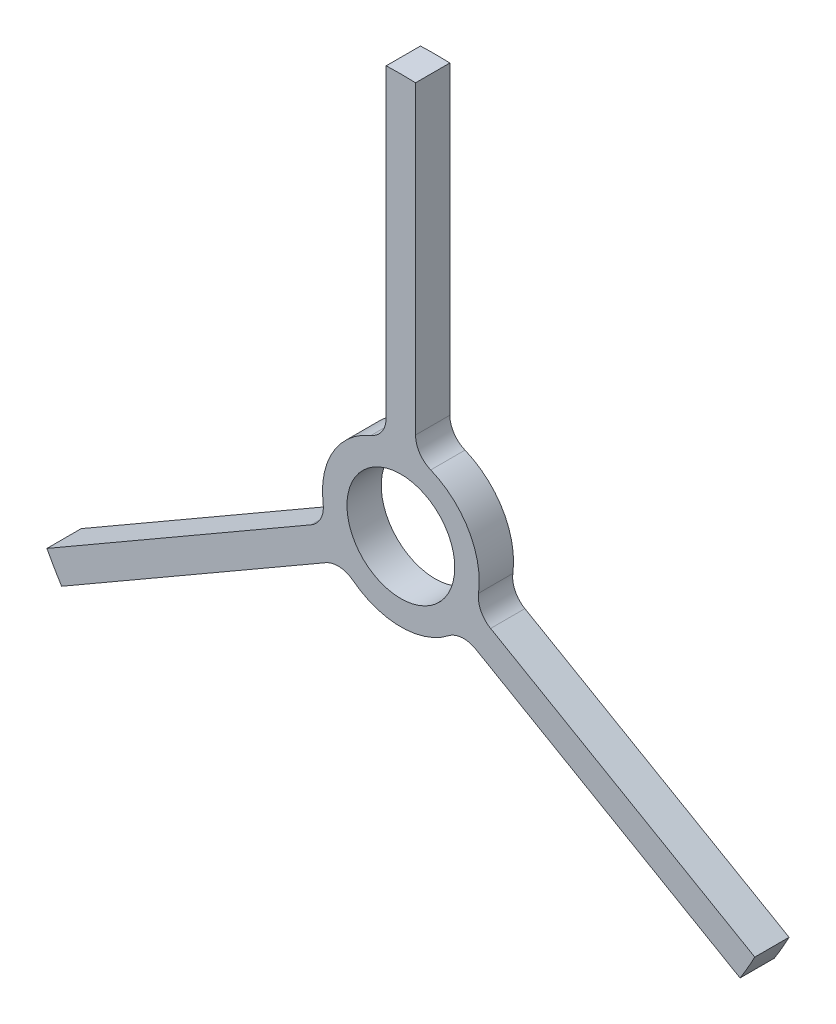
ISO-10303-21;
HEADER;
FILE_DESCRIPTION(('STEP AP214'),'2;1');
FILE_NAME('part.step','',(''),(''),'','','');
FILE_SCHEMA(('AUTOMOTIVE_DESIGN { 1 0 10303 214 1 1 1 1 }'));
ENDSEC;
DATA;
#1=APPLICATION_CONTEXT('core data for automotive mechanical design processes');
#2=APPLICATION_PROTOCOL_DEFINITION('international standard','automotive_design',2000,#1);
#3=PRODUCT_CONTEXT('',#1,'mechanical');
#4=PRODUCT('Part','Part','',(#3));
#5=PRODUCT_RELATED_PRODUCT_CATEGORY('part','',(#4));
#6=PRODUCT_DEFINITION_FORMATION('','',#4);
#7=PRODUCT_DEFINITION_CONTEXT('part definition',#1,'design');
#8=PRODUCT_DEFINITION('design','',#6,#7);
#9=PRODUCT_DEFINITION_SHAPE('','',#8);
#10=(LENGTH_UNIT() NAMED_UNIT(*) SI_UNIT(.MILLI.,.METRE.));
#11=(NAMED_UNIT(*) PLANE_ANGLE_UNIT() SI_UNIT($,.RADIAN.));
#12=(NAMED_UNIT(*) SI_UNIT($,.STERADIAN.) SOLID_ANGLE_UNIT());
#13=UNCERTAINTY_MEASURE_WITH_UNIT(LENGTH_MEASURE(1.E-05),#10,'distance_accuracy_value','');
#14=(GEOMETRIC_REPRESENTATION_CONTEXT(3) GLOBAL_UNCERTAINTY_ASSIGNED_CONTEXT((#13)) GLOBAL_UNIT_ASSIGNED_CONTEXT((#10,
#11,#12)) REPRESENTATION_CONTEXT('',''));
#15=CARTESIAN_POINT('',(0.,0.,0.));
#16=DIRECTION('',(0.,0.,1.));
#17=DIRECTION('',(1.,0.,0.));
#18=AXIS2_PLACEMENT_3D('',#15,#16,#17);
#19=CARTESIAN_POINT('',(0.,0.,7.));
#20=DIRECTION('',(0.,0.,1.));
#21=DIRECTION('',(1.,0.,0.));
#22=AXIS2_PLACEMENT_3D('',#19,#20,#21);
#23=PLANE('',#22);
#24=DIRECTION('',(0.,-1.,0.));
#25=VECTOR('',#24,1.);
#26=CARTESIAN_POINT('',(-3.,15.7162336455017,7.));
#27=LINE('',#26,#25);
#28=CARTESIAN_POINT('',(-3.,81.6690560773831,7.));
#29=VERTEX_POINT('',#28);
#30=CARTESIAN_POINT('',(-3.,19.4164878389476,7.));
#31=VERTEX_POINT('',#30);
#32=EDGE_CURVE('E228',#29,#31,#27,.T.);
#33=ORIENTED_EDGE('',*,*,#32,.T.);
#34=CARTESIAN_POINT('',(-8.,19.4164878389476,7.));
#35=DIRECTION('',(0.,0.,1.));
#36=DIRECTION('',(1.,0.,0.));
#37=AXIS2_PLACEMENT_3D('',#34,#35,#36);
#38=CIRCLE('',#37,5.);
#39=CARTESIAN_POINT('',(-6.0952380952381,14.7935145439601,7.));
#40=VERTEX_POINT('',#39);
#41=EDGE_CURVE('E333',#31,#40,#38,.F.);
#42=ORIENTED_EDGE('',*,*,#41,.T.);
#43=CARTESIAN_POINT('',(0.,0.,7.));
#44=DIRECTION('',(0.,0.,1.));
#45=DIRECTION('',(1.,0.,0.));
#46=AXIS2_PLACEMENT_3D('',#43,#44,#45);
#47=CIRCLE('',#46,16.);
#48=CARTESIAN_POINT('',(-15.8591784539431,-2.11812623938903,7.));
#49=VERTEX_POINT('',#48);
#50=EDGE_CURVE('E182',#40,#49,#47,.T.);
#51=ORIENTED_EDGE('',*,*,#50,.T.);
#52=CARTESIAN_POINT('',(-20.8151717208003,-2.7800406891981,7.));
#53=DIRECTION('',(0.,0.,1.));
#54=DIRECTION('',(1.,0.,0.));
#55=AXIS2_PLACEMENT_3D('',#52,#53,#54);
#56=CIRCLE('',#55,5.);
#57=CARTESIAN_POINT('',(-18.3151717208003,-7.11016770812032,7.));
#58=VERTEX_POINT('',#57);
#59=EDGE_CURVE('E177',#49,#58,#56,.F.);
#60=ORIENTED_EDGE('',*,*,#59,.T.);
#61=DIRECTION('',(-0.866025403784443,-0.499999999999992,0.));
#62=VECTOR('',#61,1.);
#63=CARTESIAN_POINT('',(-15.1106575888162,-5.2600406113974,7.));
#64=LINE('',#63,#62);
#65=CARTESIAN_POINT('',(-72.22747726611,-38.2364518273376,7.));
#66=VERTEX_POINT('',#65);
#67=EDGE_CURVE('E167',#58,#66,#64,.T.);
#68=ORIENTED_EDGE('',*,*,#67,.T.);
#69=CARTESIAN_POINT('',(0.,0.,7.));
#70=DIRECTION('',(0.,0.,1.));
#71=DIRECTION('',(1.,0.,0.));
#72=AXIS2_PLACEMENT_3D('',#69,#70,#71);
#73=CIRCLE('',#72,81.7241379310345);
#74=CARTESIAN_POINT('',(-69.2274772661101,-43.4326042500442,7.));
#75=VERTEX_POINT('',#74);
#76=EDGE_CURVE('E173',#66,#75,#73,.T.);
#77=ORIENTED_EDGE('',*,*,#76,.T.);
#78=DIRECTION('',(0.866025403784443,0.499999999999992,0.));
#79=VECTOR('',#78,1.);
#80=CARTESIAN_POINT('',(-12.1106575888163,-10.4561930341041,7.));
#81=LINE('',#80,#79);
#82=CARTESIAN_POINT('',(-15.3151717208004,-12.306320130827,7.));
#83=VERTEX_POINT('',#82);
#84=EDGE_CURVE('E199',#75,#83,#81,.T.);
#85=ORIENTED_EDGE('',*,*,#84,.T.);
#86=CARTESIAN_POINT('',(-12.8151717208004,-16.6364471497492,7.));
#87=DIRECTION('',(0.,0.,1.));
#88=DIRECTION('',(1.,0.,0.));
#89=AXIS2_PLACEMENT_3D('',#86,#87,#88);
#90=CIRCLE('',#89,5.);
#91=CARTESIAN_POINT('',(-9.76394035870506,-12.6753883045708,7.));
#92=VERTEX_POINT('',#91);
#93=EDGE_CURVE('E344',#83,#92,#90,.F.);
#94=ORIENTED_EDGE('',*,*,#93,.T.);
#95=CARTESIAN_POINT('',(0.,0.,7.));
#96=DIRECTION('',(0.,0.,1.));
#97=DIRECTION('',(1.,0.,0.));
#98=AXIS2_PLACEMENT_3D('',#95,#96,#97);
#99=CIRCLE('',#98,16.);
#100=CARTESIAN_POINT('',(9.76394035870489,-12.6753883045709,7.));
#101=VERTEX_POINT('',#100);
#102=EDGE_CURVE('E202',#92,#101,#99,.T.);
#103=ORIENTED_EDGE('',*,*,#102,.T.);
#104=CARTESIAN_POINT('',(12.8151717208002,-16.6364471497494,7.));
#105=DIRECTION('',(0.,0.,1.));
#106=DIRECTION('',(1.,0.,0.));
#107=AXIS2_PLACEMENT_3D('',#104,#105,#106);
#108=CIRCLE('',#107,5.);
#109=CARTESIAN_POINT('',(15.3151717208002,-12.3063201308272,7.));
#110=VERTEX_POINT('',#109);
#111=EDGE_CURVE('E350',#101,#110,#108,.F.);
#112=ORIENTED_EDGE('',*,*,#111,.T.);
#113=DIRECTION('',(0.866025403784436,-0.500000000000004,0.));
#114=VECTOR('',#113,1.);
#115=CARTESIAN_POINT('',(12.1106575888162,-10.4561930341042,7.));
#116=LINE('',#115,#114);
#117=CARTESIAN_POINT('',(69.2274772661094,-43.4326042500452,7.));
#118=VERTEX_POINT('',#117);
#119=EDGE_CURVE('E209',#110,#118,#116,.T.);
#120=ORIENTED_EDGE('',*,*,#119,.T.);
#121=CARTESIAN_POINT('',(0.,0.,7.));
#122=DIRECTION('',(0.,0.,1.));
#123=DIRECTION('',(1.,0.,0.));
#124=AXIS2_PLACEMENT_3D('',#121,#122,#123);
#125=CIRCLE('',#124,81.7241379310345);
#126=CARTESIAN_POINT('',(72.2274772661095,-38.2364518273386,7.));
#127=VERTEX_POINT('',#126);
#128=EDGE_CURVE('E212',#118,#127,#125,.T.);
#129=ORIENTED_EDGE('',*,*,#128,.T.);
#130=DIRECTION('',(-0.866025403784436,0.500000000000004,0.));
#131=VECTOR('',#130,1.);
#132=CARTESIAN_POINT('',(15.1106575888162,-5.26004061139761,7.));
#133=LINE('',#132,#131);
#134=CARTESIAN_POINT('',(18.3151717208002,-7.11016770812057,7.));
#135=VERTEX_POINT('',#134);
#136=EDGE_CURVE('E215',#127,#135,#133,.T.);
#137=ORIENTED_EDGE('',*,*,#136,.T.);
#138=CARTESIAN_POINT('',(20.8151717208002,-2.78004068919839,7.));
#139=DIRECTION('',(0.,0.,1.));
#140=DIRECTION('',(1.,0.,0.));
#141=AXIS2_PLACEMENT_3D('',#138,#139,#140);
#142=CIRCLE('',#141,5.);
#143=CARTESIAN_POINT('',(15.859178453943,-2.11812623938925,7.));
#144=VERTEX_POINT('',#143);
#145=EDGE_CURVE('E356',#135,#144,#142,.F.);
#146=ORIENTED_EDGE('',*,*,#145,.T.);
#147=CARTESIAN_POINT('',(0.,0.,7.));
#148=DIRECTION('',(0.,0.,1.));
#149=DIRECTION('',(1.,0.,0.));
#150=AXIS2_PLACEMENT_3D('',#147,#148,#149);
#151=CIRCLE('',#150,16.);
#152=CARTESIAN_POINT('',(6.0952380952381,14.7935145439601,7.));
#153=VERTEX_POINT('',#152);
#154=EDGE_CURVE('E219',#144,#153,#151,.T.);
#155=ORIENTED_EDGE('',*,*,#154,.T.);
#156=CARTESIAN_POINT('',(8.,19.4164878389476,7.));
#157=DIRECTION('',(0.,0.,1.));
#158=DIRECTION('',(1.,0.,0.));
#159=AXIS2_PLACEMENT_3D('',#156,#157,#158);
#160=CIRCLE('',#159,5.);
#161=CARTESIAN_POINT('',(3.,19.4164878389476,7.));
#162=VERTEX_POINT('',#161);
#163=EDGE_CURVE('E11',#153,#162,#160,.F.);
#164=ORIENTED_EDGE('',*,*,#163,.T.);
#165=DIRECTION('',(0.,1.,0.));
#166=VECTOR('',#165,1.);
#167=CARTESIAN_POINT('',(3.,15.7162336455017,7.));
#168=LINE('',#167,#166);
#169=CARTESIAN_POINT('',(3.,81.6690560773831,7.));
#170=VERTEX_POINT('',#169);
#171=EDGE_CURVE('E222',#162,#170,#168,.T.);
#172=ORIENTED_EDGE('',*,*,#171,.T.);
#173=CARTESIAN_POINT('',(0.,0.,7.));
#174=DIRECTION('',(0.,0.,1.));
#175=DIRECTION('',(1.,0.,0.));
#176=AXIS2_PLACEMENT_3D('',#173,#174,#175);
#177=CIRCLE('',#176,81.7241379310345);
#178=EDGE_CURVE('E225',#170,#29,#177,.T.);
#179=ORIENTED_EDGE('',*,*,#178,.T.);
#180=EDGE_LOOP('',(#33,#42,#51,#60,#68,#77,#85,#94,#103,#112,#120,#129,#137,#146,#155,#164,#172,#179));
#181=FACE_BOUND('',#180,.T.);
#182=CARTESIAN_POINT('',(0.,0.,7.));
#183=DIRECTION('',(0.,0.,1.));
#184=DIRECTION('',(1.,0.,0.));
#185=AXIS2_PLACEMENT_3D('',#182,#183,#184);
#186=CIRCLE('',#185,11.);
#187=CARTESIAN_POINT('',(11.,0.,7.));
#188=VERTEX_POINT('',#187);
#189=EDGE_CURVE('E236',#188,#188,#186,.T.);
#190=ORIENTED_EDGE('',*,*,#189,.F.);
#191=EDGE_LOOP('',(#190));
#192=FACE_BOUND('',#191,.T.);
#193=ADVANCED_FACE('F44',(#181,#192),#23,.T.);
#194=CARTESIAN_POINT('',(0.,0.,0.));
#195=DIRECTION('',(0.,0.,1.));
#196=DIRECTION('',(1.,0.,0.));
#197=AXIS2_PLACEMENT_3D('',#194,#195,#196);
#198=PLANE('',#197);
#199=CARTESIAN_POINT('',(0.,0.,0.));
#200=DIRECTION('',(0.,0.,1.));
#201=DIRECTION('',(1.,0.,0.));
#202=AXIS2_PLACEMENT_3D('',#199,#200,#201);
#203=CIRCLE('',#202,16.);
#204=CARTESIAN_POINT('',(-6.0952380952381,14.7935145439601,0.));
#205=VERTEX_POINT('',#204);
#206=CARTESIAN_POINT('',(-15.8591784539431,-2.11812623938903,0.));
#207=VERTEX_POINT('',#206);
#208=EDGE_CURVE('E232',#205,#207,#203,.T.);
#209=ORIENTED_EDGE('',*,*,#208,.F.);
#210=CARTESIAN_POINT('',(-8.,19.4164878389476,0.));
#211=DIRECTION('',(0.,0.,1.));
#212=DIRECTION('',(1.,0.,0.));
#213=AXIS2_PLACEMENT_3D('',#210,#211,#212);
#214=CIRCLE('',#213,5.);
#215=CARTESIAN_POINT('',(-3.,19.4164878389476,0.));
#216=VERTEX_POINT('',#215);
#217=EDGE_CURVE('E330',#205,#216,#214,.T.);
#218=ORIENTED_EDGE('',*,*,#217,.T.);
#219=DIRECTION('',(0.,-1.,0.));
#220=VECTOR('',#219,1.);
#221=CARTESIAN_POINT('',(-3.,15.7162336455017,0.));
#222=LINE('',#221,#220);
#223=CARTESIAN_POINT('',(-3.,81.6690560773831,0.));
#224=VERTEX_POINT('',#223);
#225=EDGE_CURVE('E270',#224,#216,#222,.T.);
#226=ORIENTED_EDGE('',*,*,#225,.F.);
#227=CARTESIAN_POINT('',(0.,0.,0.));
#228=DIRECTION('',(0.,0.,1.));
#229=DIRECTION('',(1.,0.,0.));
#230=AXIS2_PLACEMENT_3D('',#227,#228,#229);
#231=CIRCLE('',#230,81.7241379310345);
#232=CARTESIAN_POINT('',(3.,81.6690560773831,0.));
#233=VERTEX_POINT('',#232);
#234=EDGE_CURVE('E267',#233,#224,#231,.T.);
#235=ORIENTED_EDGE('',*,*,#234,.F.);
#236=DIRECTION('',(0.,1.,0.));
#237=VECTOR('',#236,1.);
#238=CARTESIAN_POINT('',(3.,15.7162336455017,0.));
#239=LINE('',#238,#237);
#240=CARTESIAN_POINT('',(3.,19.4164878389476,0.));
#241=VERTEX_POINT('',#240);
#242=EDGE_CURVE('E264',#241,#233,#239,.T.);
#243=ORIENTED_EDGE('',*,*,#242,.F.);
#244=CARTESIAN_POINT('',(8.,19.4164878389476,0.));
#245=DIRECTION('',(0.,0.,1.));
#246=DIRECTION('',(1.,0.,0.));
#247=AXIS2_PLACEMENT_3D('',#244,#245,#246);
#248=CIRCLE('',#247,5.);
#249=CARTESIAN_POINT('',(6.0952380952381,14.7935145439601,0.));
#250=VERTEX_POINT('',#249);
#251=EDGE_CURVE('E53',#241,#250,#248,.T.);
#252=ORIENTED_EDGE('',*,*,#251,.T.);
#253=CARTESIAN_POINT('',(0.,0.,0.));
#254=DIRECTION('',(0.,0.,1.));
#255=DIRECTION('',(1.,0.,0.));
#256=AXIS2_PLACEMENT_3D('',#253,#254,#255);
#257=CIRCLE('',#256,16.);
#258=CARTESIAN_POINT('',(15.859178453943,-2.11812623938925,0.));
#259=VERTEX_POINT('',#258);
#260=EDGE_CURVE('E260',#259,#250,#257,.T.);
#261=ORIENTED_EDGE('',*,*,#260,.F.);
#262=CARTESIAN_POINT('',(20.8151717208002,-2.78004068919839,0.));
#263=DIRECTION('',(0.,0.,1.));
#264=DIRECTION('',(1.,0.,0.));
#265=AXIS2_PLACEMENT_3D('',#262,#263,#264);
#266=CIRCLE('',#265,5.);
#267=CARTESIAN_POINT('',(18.3151717208002,-7.11016770812057,0.));
#268=VERTEX_POINT('',#267);
#269=EDGE_CURVE('E353',#259,#268,#266,.T.);
#270=ORIENTED_EDGE('',*,*,#269,.T.);
#271=DIRECTION('',(-0.866025403784436,0.500000000000004,0.));
#272=VECTOR('',#271,1.);
#273=CARTESIAN_POINT('',(15.1106575888162,-5.26004061139761,0.));
#274=LINE('',#273,#272);
#275=CARTESIAN_POINT('',(72.2274772661095,-38.2364518273386,0.));
#276=VERTEX_POINT('',#275);
#277=EDGE_CURVE('E256',#276,#268,#274,.T.);
#278=ORIENTED_EDGE('',*,*,#277,.F.);
#279=CARTESIAN_POINT('',(0.,0.,0.));
#280=DIRECTION('',(0.,0.,1.));
#281=DIRECTION('',(1.,0.,0.));
#282=AXIS2_PLACEMENT_3D('',#279,#280,#281);
#283=CIRCLE('',#282,81.7241379310345);
#284=CARTESIAN_POINT('',(69.2274772661094,-43.4326042500452,0.));
#285=VERTEX_POINT('',#284);
#286=EDGE_CURVE('E253',#285,#276,#283,.T.);
#287=ORIENTED_EDGE('',*,*,#286,.F.);
#288=DIRECTION('',(0.866025403784436,-0.500000000000004,0.));
#289=VECTOR('',#288,1.);
#290=CARTESIAN_POINT('',(12.1106575888162,-10.4561930341042,0.));
#291=LINE('',#290,#289);
#292=CARTESIAN_POINT('',(15.3151717208002,-12.3063201308272,0.));
#293=VERTEX_POINT('',#292);
#294=EDGE_CURVE('E250',#293,#285,#291,.T.);
#295=ORIENTED_EDGE('',*,*,#294,.F.);
#296=CARTESIAN_POINT('',(12.8151717208002,-16.6364471497494,0.));
#297=DIRECTION('',(0.,0.,1.));
#298=DIRECTION('',(1.,0.,0.));
#299=AXIS2_PLACEMENT_3D('',#296,#297,#298);
#300=CIRCLE('',#299,5.);
#301=CARTESIAN_POINT('',(9.76394035870489,-12.6753883045709,0.));
#302=VERTEX_POINT('',#301);
#303=EDGE_CURVE('E347',#293,#302,#300,.T.);
#304=ORIENTED_EDGE('',*,*,#303,.T.);
#305=CARTESIAN_POINT('',(0.,0.,0.));
#306=DIRECTION('',(0.,0.,1.));
#307=DIRECTION('',(1.,0.,0.));
#308=AXIS2_PLACEMENT_3D('',#305,#306,#307);
#309=CIRCLE('',#308,16.);
#310=CARTESIAN_POINT('',(-9.76394035870506,-12.6753883045708,0.));
#311=VERTEX_POINT('',#310);
#312=EDGE_CURVE('E246',#311,#302,#309,.T.);
#313=ORIENTED_EDGE('',*,*,#312,.F.);
#314=CARTESIAN_POINT('',(-12.8151717208004,-16.6364471497492,0.));
#315=DIRECTION('',(0.,0.,1.));
#316=DIRECTION('',(1.,0.,0.));
#317=AXIS2_PLACEMENT_3D('',#314,#315,#316);
#318=CIRCLE('',#317,5.);
#319=CARTESIAN_POINT('',(-15.3151717208004,-12.306320130827,0.));
#320=VERTEX_POINT('',#319);
#321=EDGE_CURVE('E341',#311,#320,#318,.T.);
#322=ORIENTED_EDGE('',*,*,#321,.T.);
#323=DIRECTION('',(0.866025403784443,0.499999999999992,0.));
#324=VECTOR('',#323,1.);
#325=CARTESIAN_POINT('',(-12.1106575888163,-10.4561930341041,0.));
#326=LINE('',#325,#324);
#327=CARTESIAN_POINT('',(-69.2274772661101,-43.4326042500442,0.));
#328=VERTEX_POINT('',#327);
#329=EDGE_CURVE('E242',#328,#320,#326,.T.);
#330=ORIENTED_EDGE('',*,*,#329,.F.);
#331=CARTESIAN_POINT('',(0.,0.,0.));
#332=DIRECTION('',(0.,0.,1.));
#333=DIRECTION('',(1.,0.,0.));
#334=AXIS2_PLACEMENT_3D('',#331,#332,#333);
#335=CIRCLE('',#334,81.7241379310345);
#336=CARTESIAN_POINT('',(-72.22747726611,-38.2364518273376,0.));
#337=VERTEX_POINT('',#336);
#338=EDGE_CURVE('E239',#337,#328,#335,.T.);
#339=ORIENTED_EDGE('',*,*,#338,.F.);
#340=DIRECTION('',(-0.866025403784443,-0.499999999999992,0.));
#341=VECTOR('',#340,1.);
#342=CARTESIAN_POINT('',(-15.1106575888162,-5.2600406113974,0.));
#343=LINE('',#342,#341);
#344=CARTESIAN_POINT('',(-18.3151717208003,-7.11016770812032,0.));
#345=VERTEX_POINT('',#344);
#346=EDGE_CURVE('E188',#345,#337,#343,.T.);
#347=ORIENTED_EDGE('',*,*,#346,.F.);
#348=CARTESIAN_POINT('',(-20.8151717208003,-2.7800406891981,0.));
#349=DIRECTION('',(0.,0.,1.));
#350=DIRECTION('',(1.,0.,0.));
#351=AXIS2_PLACEMENT_3D('',#348,#349,#350);
#352=CIRCLE('',#351,5.);
#353=EDGE_CURVE('E336',#345,#207,#352,.T.);
#354=ORIENTED_EDGE('',*,*,#353,.T.);
#355=EDGE_LOOP('',(#209,#218,#226,#235,#243,#252,#261,#270,#278,#287,#295,#304,#313,#322,#330,
#339,#347,#354));
#356=FACE_BOUND('',#355,.T.);
#357=CARTESIAN_POINT('',(0.,0.,0.));
#358=DIRECTION('',(0.,0.,1.));
#359=DIRECTION('',(1.,0.,0.));
#360=AXIS2_PLACEMENT_3D('',#357,#358,#359);
#361=CIRCLE('',#360,11.);
#362=CARTESIAN_POINT('',(11.,0.,0.));
#363=VERTEX_POINT('',#362);
#364=EDGE_CURVE('E392',#363,#363,#361,.T.);
#365=ORIENTED_EDGE('',*,*,#364,.T.);
#366=EDGE_LOOP('',(#365));
#367=FACE_BOUND('',#366,.T.);
#368=ADVANCED_FACE('F363',(#356,#367),#198,.F.);
#369=CARTESIAN_POINT('',(0.,0.,7.));
#370=DIRECTION('',(0.,0.,-1.));
#371=DIRECTION('',(-1.,0.,0.));
#372=AXIS2_PLACEMENT_3D('',#369,#370,#371);
#373=CYLINDRICAL_SURFACE('',#372,16.);
#374=ORIENTED_EDGE('',*,*,#50,.F.);
#375=DIRECTION('',(0.,0.,-1.));
#376=VECTOR('',#375,1.);
#377=CARTESIAN_POINT('',(-6.0952380952381,14.7935145439601,7.));
#378=LINE('',#377,#376);
#379=EDGE_CURVE('E293',#40,#205,#378,.T.);
#380=ORIENTED_EDGE('',*,*,#379,.T.);
#381=ORIENTED_EDGE('',*,*,#208,.T.);
#382=DIRECTION('',(0.,0.,-1.));
#383=VECTOR('',#382,1.);
#384=CARTESIAN_POINT('',(-15.8591784539431,-2.11812623938903,7.));
#385=LINE('',#384,#383);
#386=EDGE_CURVE('E192',#207,#49,#385,.F.);
#387=ORIENTED_EDGE('',*,*,#386,.T.);
#388=EDGE_LOOP('',(#374,#380,#381,#387));
#389=FACE_BOUND('',#388,.T.);
#390=ADVANCED_FACE('F388',(#389),#373,.T.);
#391=CARTESIAN_POINT('',(-15.1106575888162,-5.2600406113974,7.));
#392=DIRECTION('',(0.499999999999992,-0.866025403784443,0.));
#393=DIRECTION('',(0.866025403784443,0.499999999999992,0.));
#394=AXIS2_PLACEMENT_3D('',#391,#392,#393);
#395=PLANE('',#394);
#396=ORIENTED_EDGE('',*,*,#67,.F.);
#397=DIRECTION('',(0.,0.,1.));
#398=VECTOR('',#397,1.);
#399=CARTESIAN_POINT('',(-18.3151717208003,-7.11016770812032,0.));
#400=LINE('',#399,#398);
#401=EDGE_CURVE('E300',#58,#345,#400,.F.);
#402=ORIENTED_EDGE('',*,*,#401,.T.);
#403=ORIENTED_EDGE('',*,*,#346,.T.);
#404=DIRECTION('',(0.,0.,-1.));
#405=VECTOR('',#404,1.);
#406=CARTESIAN_POINT('',(-72.22747726611,-38.2364518273376,7.));
#407=LINE('',#406,#405);
#408=EDGE_CURVE('E185',#66,#337,#407,.T.);
#409=ORIENTED_EDGE('',*,*,#408,.F.);
#410=EDGE_LOOP('',(#396,#402,#403,#409));
#411=FACE_BOUND('',#410,.T.);
#412=ADVANCED_FACE('F186',(#411),#395,.F.);
#413=CARTESIAN_POINT('',(0.,0.,7.));
#414=DIRECTION('',(0.,0.,-1.));
#415=DIRECTION('',(-1.,0.,0.));
#416=AXIS2_PLACEMENT_3D('',#413,#414,#415);
#417=CYLINDRICAL_SURFACE('',#416,81.7241379310345);
#418=ORIENTED_EDGE('',*,*,#338,.T.);
#419=DIRECTION('',(0.,0.,-1.));
#420=VECTOR('',#419,1.);
#421=CARTESIAN_POINT('',(-69.2274772661101,-43.4326042500442,7.));
#422=LINE('',#421,#420);
#423=EDGE_CURVE('E193',#75,#328,#422,.T.);
#424=ORIENTED_EDGE('',*,*,#423,.F.);
#425=ORIENTED_EDGE('',*,*,#76,.F.);
#426=ORIENTED_EDGE('',*,*,#408,.T.);
#427=EDGE_LOOP('',(#418,#424,#425,#426));
#428=FACE_BOUND('',#427,.T.);
#429=ADVANCED_FACE('F195',(#428),#417,.T.);
#430=CARTESIAN_POINT('',(-12.1106575888163,-10.4561930341041,7.));
#431=DIRECTION('',(-0.499999999999992,0.866025403784443,0.));
#432=DIRECTION('',(-0.866025403784443,-0.499999999999992,0.));
#433=AXIS2_PLACEMENT_3D('',#430,#431,#432);
#434=PLANE('',#433);
#435=ORIENTED_EDGE('',*,*,#329,.T.);
#436=DIRECTION('',(0.,0.,1.));
#437=VECTOR('',#436,1.);
#438=CARTESIAN_POINT('',(-15.3151717208004,-12.306320130827,7.));
#439=LINE('',#438,#437);
#440=EDGE_CURVE('E310',#320,#83,#439,.T.);
#441=ORIENTED_EDGE('',*,*,#440,.T.);
#442=ORIENTED_EDGE('',*,*,#84,.F.);
#443=ORIENTED_EDGE('',*,*,#423,.T.);
#444=EDGE_LOOP('',(#435,#441,#442,#443));
#445=FACE_BOUND('',#444,.T.);
#446=ADVANCED_FACE('F434',(#445),#434,.F.);
#447=CARTESIAN_POINT('',(0.,0.,7.));
#448=DIRECTION('',(0.,0.,-1.));
#449=DIRECTION('',(-1.,0.,0.));
#450=AXIS2_PLACEMENT_3D('',#447,#448,#449);
#451=CYLINDRICAL_SURFACE('',#450,16.);
#452=ORIENTED_EDGE('',*,*,#102,.F.);
#453=DIRECTION('',(0.,0.,-1.));
#454=VECTOR('',#453,1.);
#455=CARTESIAN_POINT('',(-9.76394035870506,-12.6753883045708,7.));
#456=LINE('',#455,#454);
#457=EDGE_CURVE('E306',#92,#311,#456,.T.);
#458=ORIENTED_EDGE('',*,*,#457,.T.);
#459=ORIENTED_EDGE('',*,*,#312,.T.);
#460=DIRECTION('',(0.,0.,-1.));
#461=VECTOR('',#460,1.);
#462=CARTESIAN_POINT('',(9.76394035870489,-12.6753883045709,7.));
#463=LINE('',#462,#461);
#464=EDGE_CURVE('E303',#302,#101,#463,.F.);
#465=ORIENTED_EDGE('',*,*,#464,.T.);
#466=EDGE_LOOP('',(#452,#458,#459,#465));
#467=FACE_BOUND('',#466,.T.);
#468=ADVANCED_FACE('F430',(#467),#451,.T.);
#469=CARTESIAN_POINT('',(12.1106575888162,-10.4561930341042,7.));
#470=DIRECTION('',(0.500000000000004,0.866025403784436,0.));
#471=DIRECTION('',(-0.866025403784436,0.500000000000004,0.));
#472=AXIS2_PLACEMENT_3D('',#469,#470,#471);
#473=PLANE('',#472);
#474=ORIENTED_EDGE('',*,*,#119,.F.);
#475=DIRECTION('',(0.,0.,1.));
#476=VECTOR('',#475,1.);
#477=CARTESIAN_POINT('',(15.3151717208002,-12.3063201308272,0.));
#478=LINE('',#477,#476);
#479=EDGE_CURVE('E313',#110,#293,#478,.F.);
#480=ORIENTED_EDGE('',*,*,#479,.T.);
#481=ORIENTED_EDGE('',*,*,#294,.T.);
#482=DIRECTION('',(0.,0.,-1.));
#483=VECTOR('',#482,1.);
#484=CARTESIAN_POINT('',(69.2274772661094,-43.4326042500452,7.));
#485=LINE('',#484,#483);
#486=EDGE_CURVE('E285',#118,#285,#485,.T.);
#487=ORIENTED_EDGE('',*,*,#486,.F.);
#488=EDGE_LOOP('',(#474,#480,#481,#487));
#489=FACE_BOUND('',#488,.T.);
#490=ADVANCED_FACE('F426',(#489),#473,.F.);
#491=CARTESIAN_POINT('',(0.,0.,7.));
#492=DIRECTION('',(0.,0.,-1.));
#493=DIRECTION('',(-1.,0.,0.));
#494=AXIS2_PLACEMENT_3D('',#491,#492,#493);
#495=CYLINDRICAL_SURFACE('',#494,81.7241379310345);
#496=ORIENTED_EDGE('',*,*,#286,.T.);
#497=DIRECTION('',(0.,0.,-1.));
#498=VECTOR('',#497,1.);
#499=CARTESIAN_POINT('',(72.2274772661095,-38.2364518273386,7.));
#500=LINE('',#499,#498);
#501=EDGE_CURVE('E281',#127,#276,#500,.T.);
#502=ORIENTED_EDGE('',*,*,#501,.F.);
#503=ORIENTED_EDGE('',*,*,#128,.F.);
#504=ORIENTED_EDGE('',*,*,#486,.T.);
#505=EDGE_LOOP('',(#496,#502,#503,#504));
#506=FACE_BOUND('',#505,.T.);
#507=ADVANCED_FACE('F422',(#506),#495,.T.);
#508=CARTESIAN_POINT('',(15.1106575888162,-5.26004061139761,7.));
#509=DIRECTION('',(-0.500000000000004,-0.866025403784436,0.));
#510=DIRECTION('',(0.866025403784436,-0.500000000000004,0.));
#511=AXIS2_PLACEMENT_3D('',#508,#509,#510);
#512=PLANE('',#511);
#513=ORIENTED_EDGE('',*,*,#277,.T.);
#514=DIRECTION('',(0.,0.,1.));
#515=VECTOR('',#514,1.);
#516=CARTESIAN_POINT('',(18.3151717208002,-7.11016770812057,7.));
#517=LINE('',#516,#515);
#518=EDGE_CURVE('E324',#268,#135,#517,.T.);
#519=ORIENTED_EDGE('',*,*,#518,.T.);
#520=ORIENTED_EDGE('',*,*,#136,.F.);
#521=ORIENTED_EDGE('',*,*,#501,.T.);
#522=EDGE_LOOP('',(#513,#519,#520,#521));
#523=FACE_BOUND('',#522,.T.);
#524=ADVANCED_FACE('F419',(#523),#512,.F.);
#525=CARTESIAN_POINT('',(0.,0.,7.));
#526=DIRECTION('',(0.,0.,-1.));
#527=DIRECTION('',(-1.,0.,0.));
#528=AXIS2_PLACEMENT_3D('',#525,#526,#527);
#529=CYLINDRICAL_SURFACE('',#528,16.);
#530=ORIENTED_EDGE('',*,*,#154,.F.);
#531=DIRECTION('',(0.,0.,-1.));
#532=VECTOR('',#531,1.);
#533=CARTESIAN_POINT('',(15.859178453943,-2.11812623938925,7.));
#534=LINE('',#533,#532);
#535=EDGE_CURVE('E320',#144,#259,#534,.T.);
#536=ORIENTED_EDGE('',*,*,#535,.T.);
#537=ORIENTED_EDGE('',*,*,#260,.T.);
#538=DIRECTION('',(0.,0.,-1.));
#539=VECTOR('',#538,1.);
#540=CARTESIAN_POINT('',(6.0952380952381,14.7935145439601,7.));
#541=LINE('',#540,#539);
#542=EDGE_CURVE('E317',#250,#153,#541,.F.);
#543=ORIENTED_EDGE('',*,*,#542,.T.);
#544=EDGE_LOOP('',(#530,#536,#537,#543));
#545=FACE_BOUND('',#544,.T.);
#546=ADVANCED_FACE('F368',(#545),#529,.T.);
#547=CARTESIAN_POINT('',(3.,15.7162336455017,7.));
#548=DIRECTION('',(-1.,0.,0.));
#549=DIRECTION('',(0.,0.,1.));
#550=AXIS2_PLACEMENT_3D('',#547,#548,#549);
#551=PLANE('',#550);
#552=ORIENTED_EDGE('',*,*,#171,.F.);
#553=DIRECTION('',(0.,0.,1.));
#554=VECTOR('',#553,1.);
#555=CARTESIAN_POINT('',(3.,19.4164878389476,0.));
#556=LINE('',#555,#554);
#557=EDGE_CURVE('E327',#162,#241,#556,.F.);
#558=ORIENTED_EDGE('',*,*,#557,.T.);
#559=ORIENTED_EDGE('',*,*,#242,.T.);
#560=DIRECTION('',(0.,0.,-1.));
#561=VECTOR('',#560,1.);
#562=CARTESIAN_POINT('',(3.,81.6690560773831,7.));
#563=LINE('',#562,#561);
#564=EDGE_CURVE('E277',#170,#233,#563,.T.);
#565=ORIENTED_EDGE('',*,*,#564,.F.);
#566=EDGE_LOOP('',(#552,#558,#559,#565));
#567=FACE_BOUND('',#566,.T.);
#568=ADVANCED_FACE('F371',(#567),#551,.F.);
#569=CARTESIAN_POINT('',(0.,0.,7.));
#570=DIRECTION('',(0.,0.,-1.));
#571=DIRECTION('',(-1.,0.,0.));
#572=AXIS2_PLACEMENT_3D('',#569,#570,#571);
#573=CYLINDRICAL_SURFACE('',#572,81.7241379310345);
#574=ORIENTED_EDGE('',*,*,#234,.T.);
#575=DIRECTION('',(0.,0.,-1.));
#576=VECTOR('',#575,1.);
#577=CARTESIAN_POINT('',(-3.,81.6690560773831,7.));
#578=LINE('',#577,#576);
#579=EDGE_CURVE('E231',#29,#224,#578,.T.);
#580=ORIENTED_EDGE('',*,*,#579,.F.);
#581=ORIENTED_EDGE('',*,*,#178,.F.);
#582=ORIENTED_EDGE('',*,*,#564,.T.);
#583=EDGE_LOOP('',(#574,#580,#581,#582));
#584=FACE_BOUND('',#583,.T.);
#585=ADVANCED_FACE('F378',(#584),#573,.T.);
#586=CARTESIAN_POINT('',(-3.,15.7162336455017,7.));
#587=DIRECTION('',(1.,0.,0.));
#588=DIRECTION('',(0.,0.,-1.));
#589=AXIS2_PLACEMENT_3D('',#586,#587,#588);
#590=PLANE('',#589);
#591=ORIENTED_EDGE('',*,*,#225,.T.);
#592=DIRECTION('',(0.,0.,1.));
#593=VECTOR('',#592,1.);
#594=CARTESIAN_POINT('',(-3.,19.4164878389476,7.));
#595=LINE('',#594,#593);
#596=EDGE_CURVE('E297',#216,#31,#595,.T.);
#597=ORIENTED_EDGE('',*,*,#596,.T.);
#598=ORIENTED_EDGE('',*,*,#32,.F.);
#599=ORIENTED_EDGE('',*,*,#579,.T.);
#600=EDGE_LOOP('',(#591,#597,#598,#599));
#601=FACE_BOUND('',#600,.T.);
#602=ADVANCED_FACE('F381',(#601),#590,.F.);
#603=CARTESIAN_POINT('',(0.,0.,7.));
#604=DIRECTION('',(0.,0.,-1.));
#605=DIRECTION('',(-1.,0.,0.));
#606=AXIS2_PLACEMENT_3D('',#603,#604,#605);
#607=CYLINDRICAL_SURFACE('',#606,11.);
#608=ORIENTED_EDGE('',*,*,#189,.T.);
#609=EDGE_LOOP('',(#608));
#610=FACE_BOUND('',#609,.T.);
#611=ORIENTED_EDGE('',*,*,#364,.F.);
#612=EDGE_LOOP('',(#611));
#613=FACE_BOUND('',#612,.T.);
#614=ADVANCED_FACE('F400',(#610,#613),#607,.F.);
#615=CARTESIAN_POINT('',(-8.,19.4164878389476,7.));
#616=DIRECTION('',(0.,0.,-1.));
#617=DIRECTION('',(-1.,0.,0.));
#618=AXIS2_PLACEMENT_3D('',#615,#616,#617);
#619=CYLINDRICAL_SURFACE('',#618,5.);
#620=ORIENTED_EDGE('',*,*,#41,.F.);
#621=ORIENTED_EDGE('',*,*,#596,.F.);
#622=ORIENTED_EDGE('',*,*,#217,.F.);
#623=ORIENTED_EDGE('',*,*,#379,.F.);
#624=EDGE_LOOP('',(#620,#621,#622,#623));
#625=FACE_BOUND('',#624,.T.);
#626=ADVANCED_FACE('F384',(#625),#619,.F.);
#627=CARTESIAN_POINT('',(-20.8151717208003,-2.7800406891981,7.));
#628=DIRECTION('',(0.,0.,-1.));
#629=DIRECTION('',(-1.,0.,0.));
#630=AXIS2_PLACEMENT_3D('',#627,#628,#629);
#631=CYLINDRICAL_SURFACE('',#630,5.);
#632=ORIENTED_EDGE('',*,*,#59,.F.);
#633=ORIENTED_EDGE('',*,*,#386,.F.);
#634=ORIENTED_EDGE('',*,*,#353,.F.);
#635=ORIENTED_EDGE('',*,*,#401,.F.);
#636=EDGE_LOOP('',(#632,#633,#634,#635));
#637=FACE_BOUND('',#636,.T.);
#638=ADVANCED_FACE('F447',(#637),#631,.F.);
#639=CARTESIAN_POINT('',(-12.8151717208004,-16.6364471497492,7.));
#640=DIRECTION('',(0.,0.,-1.));
#641=DIRECTION('',(-1.,0.,0.));
#642=AXIS2_PLACEMENT_3D('',#639,#640,#641);
#643=CYLINDRICAL_SURFACE('',#642,5.);
#644=ORIENTED_EDGE('',*,*,#93,.F.);
#645=ORIENTED_EDGE('',*,*,#440,.F.);
#646=ORIENTED_EDGE('',*,*,#321,.F.);
#647=ORIENTED_EDGE('',*,*,#457,.F.);
#648=EDGE_LOOP('',(#644,#645,#646,#647));
#649=FACE_BOUND('',#648,.T.);
#650=ADVANCED_FACE('F450',(#649),#643,.F.);
#651=CARTESIAN_POINT('',(12.8151717208002,-16.6364471497494,7.));
#652=DIRECTION('',(0.,0.,-1.));
#653=DIRECTION('',(-1.,0.,0.));
#654=AXIS2_PLACEMENT_3D('',#651,#652,#653);
#655=CYLINDRICAL_SURFACE('',#654,5.);
#656=ORIENTED_EDGE('',*,*,#111,.F.);
#657=ORIENTED_EDGE('',*,*,#464,.F.);
#658=ORIENTED_EDGE('',*,*,#303,.F.);
#659=ORIENTED_EDGE('',*,*,#479,.F.);
#660=EDGE_LOOP('',(#656,#657,#658,#659));
#661=FACE_BOUND('',#660,.T.);
#662=ADVANCED_FACE('F454',(#661),#655,.F.);
#663=CARTESIAN_POINT('',(20.8151717208002,-2.78004068919839,7.));
#664=DIRECTION('',(0.,0.,-1.));
#665=DIRECTION('',(-1.,0.,0.));
#666=AXIS2_PLACEMENT_3D('',#663,#664,#665);
#667=CYLINDRICAL_SURFACE('',#666,5.);
#668=ORIENTED_EDGE('',*,*,#145,.F.);
#669=ORIENTED_EDGE('',*,*,#518,.F.);
#670=ORIENTED_EDGE('',*,*,#269,.F.);
#671=ORIENTED_EDGE('',*,*,#535,.F.);
#672=EDGE_LOOP('',(#668,#669,#670,#671));
#673=FACE_BOUND('',#672,.T.);
#674=ADVANCED_FACE('F457',(#673),#667,.F.);
#675=CARTESIAN_POINT('',(8.,19.4164878389476,7.));
#676=DIRECTION('',(0.,0.,-1.));
#677=DIRECTION('',(-1.,0.,0.));
#678=AXIS2_PLACEMENT_3D('',#675,#676,#677);
#679=CYLINDRICAL_SURFACE('',#678,5.);
#680=ORIENTED_EDGE('',*,*,#163,.F.);
#681=ORIENTED_EDGE('',*,*,#542,.F.);
#682=ORIENTED_EDGE('',*,*,#251,.F.);
#683=ORIENTED_EDGE('',*,*,#557,.F.);
#684=EDGE_LOOP('',(#680,#681,#682,#683));
#685=FACE_BOUND('',#684,.T.);
#686=ADVANCED_FACE('F46',(#685),#679,.F.);
#687=CLOSED_SHELL('',(#193,#368,#390,#412,#429,#446,#468,#490,#507,#524,#546,#568,#585,#602,
#614,#626,#638,#650,#662,#674,#686));
#688=MANIFOLD_SOLID_BREP('B2',#687);
#689=ADVANCED_BREP_SHAPE_REPRESENTATION('',(#18,#688),#14);
#690=SHAPE_DEFINITION_REPRESENTATION(#9,#689);
ENDSEC;
END-ISO-10303-21;
